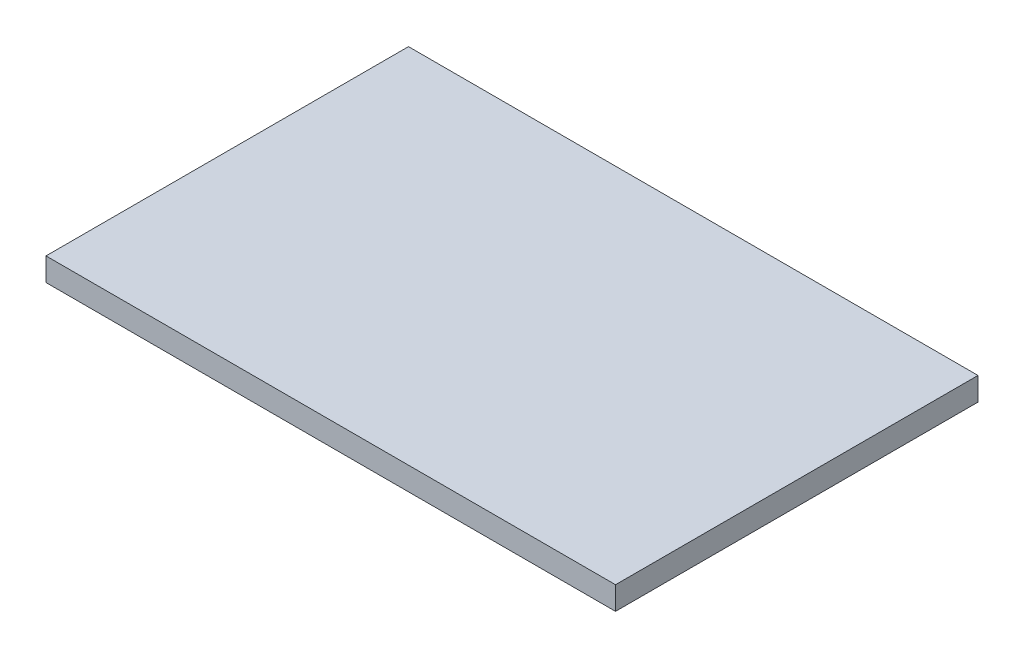
ISO-10303-21;
HEADER;
FILE_DESCRIPTION(('STEP AP214'),'2;1');
FILE_NAME('part.step','',(''),(''),'','','');
FILE_SCHEMA(('AUTOMOTIVE_DESIGN { 1 0 10303 214 1 1 1 1 }'));
ENDSEC;
DATA;
#1=APPLICATION_CONTEXT('core data for automotive mechanical design processes');
#2=APPLICATION_PROTOCOL_DEFINITION('international standard','automotive_design',2000,#1);
#3=PRODUCT_CONTEXT('',#1,'mechanical');
#4=PRODUCT('Part','Part','',(#3));
#5=PRODUCT_RELATED_PRODUCT_CATEGORY('part','',(#4));
#6=PRODUCT_DEFINITION_FORMATION('','',#4);
#7=PRODUCT_DEFINITION_CONTEXT('part definition',#1,'design');
#8=PRODUCT_DEFINITION('design','',#6,#7);
#9=PRODUCT_DEFINITION_SHAPE('','',#8);
#10=(LENGTH_UNIT() NAMED_UNIT(*) SI_UNIT(.MILLI.,.METRE.));
#11=(NAMED_UNIT(*) PLANE_ANGLE_UNIT() SI_UNIT($,.RADIAN.));
#12=(NAMED_UNIT(*) SI_UNIT($,.STERADIAN.) SOLID_ANGLE_UNIT());
#13=UNCERTAINTY_MEASURE_WITH_UNIT(LENGTH_MEASURE(1.E-05),#10,'distance_accuracy_value','');
#14=(GEOMETRIC_REPRESENTATION_CONTEXT(3) GLOBAL_UNCERTAINTY_ASSIGNED_CONTEXT((#13)) GLOBAL_UNIT_ASSIGNED_CONTEXT((#10,
#11,#12)) REPRESENTATION_CONTEXT('',''));
#15=CARTESIAN_POINT('',(0.,0.,0.));
#16=DIRECTION('',(0.,0.,1.));
#17=DIRECTION('',(1.,0.,0.));
#18=AXIS2_PLACEMENT_3D('',#15,#16,#17);
#19=CARTESIAN_POINT('',(0.,50.8,0.));
#20=DIRECTION('',(1.,0.,0.));
#21=DIRECTION('',(0.,0.,-1.));
#22=AXIS2_PLACEMENT_3D('',#19,#20,#21);
#23=PLANE('',#22);
#24=DIRECTION('',(0.,0.,1.));
#25=VECTOR('',#24,1.);
#26=CARTESIAN_POINT('',(0.,0.,0.));
#27=LINE('',#26,#25);
#28=CARTESIAN_POINT('',(0.,0.,0.));
#29=VERTEX_POINT('',#28);
#30=CARTESIAN_POINT('',(0.,0.,797.1));
#31=VERTEX_POINT('',#30);
#32=EDGE_CURVE('E98',#29,#31,#27,.T.);
#33=ORIENTED_EDGE('',*,*,#32,.T.);
#34=DIRECTION('',(0.,-1.,0.));
#35=VECTOR('',#34,1.);
#36=CARTESIAN_POINT('',(0.,50.8,797.1));
#37=LINE('',#36,#35);
#38=CARTESIAN_POINT('',(0.,50.8,797.1));
#39=VERTEX_POINT('',#38);
#40=EDGE_CURVE('E11',#39,#31,#37,.T.);
#41=ORIENTED_EDGE('',*,*,#40,.F.);
#42=DIRECTION('',(0.,0.,1.));
#43=VECTOR('',#42,1.);
#44=CARTESIAN_POINT('',(0.,50.8,0.));
#45=LINE('',#44,#43);
#46=CARTESIAN_POINT('',(0.,50.8,0.));
#47=VERTEX_POINT('',#46);
#48=EDGE_CURVE('E86',#47,#39,#45,.T.);
#49=ORIENTED_EDGE('',*,*,#48,.F.);
#50=DIRECTION('',(0.,-1.,0.));
#51=VECTOR('',#50,1.);
#52=CARTESIAN_POINT('',(0.,50.8,0.));
#53=LINE('',#52,#51);
#54=EDGE_CURVE('E94',#47,#29,#53,.T.);
#55=ORIENTED_EDGE('',*,*,#54,.T.);
#56=EDGE_LOOP('',(#33,#41,#49,#55));
#57=FACE_BOUND('',#56,.T.);
#58=ADVANCED_FACE('F35',(#57),#23,.F.);
#59=CARTESIAN_POINT('',(0.,50.8,797.1));
#60=DIRECTION('',(0.,0.,-1.));
#61=DIRECTION('',(-1.,0.,0.));
#62=AXIS2_PLACEMENT_3D('',#59,#60,#61);
#63=PLANE('',#62);
#64=DIRECTION('',(1.,0.,0.));
#65=VECTOR('',#64,1.);
#66=CARTESIAN_POINT('',(0.,0.,797.1));
#67=LINE('',#66,#65);
#68=CARTESIAN_POINT('',(1252.4,0.,797.1));
#69=VERTEX_POINT('',#68);
#70=EDGE_CURVE('E90',#31,#69,#67,.T.);
#71=ORIENTED_EDGE('',*,*,#70,.T.);
#72=DIRECTION('',(0.,-1.,0.));
#73=VECTOR('',#72,1.);
#74=CARTESIAN_POINT('',(1252.4,50.8,797.1));
#75=LINE('',#74,#73);
#76=CARTESIAN_POINT('',(1252.4,50.8,797.1));
#77=VERTEX_POINT('',#76);
#78=EDGE_CURVE('E43',#77,#69,#75,.T.);
#79=ORIENTED_EDGE('',*,*,#78,.F.);
#80=DIRECTION('',(1.,0.,0.));
#81=VECTOR('',#80,1.);
#82=CARTESIAN_POINT('',(0.,50.8,797.1));
#83=LINE('',#82,#81);
#84=EDGE_CURVE('E81',#39,#77,#83,.T.);
#85=ORIENTED_EDGE('',*,*,#84,.F.);
#86=ORIENTED_EDGE('',*,*,#40,.T.);
#87=EDGE_LOOP('',(#71,#79,#85,#86));
#88=FACE_BOUND('',#87,.T.);
#89=ADVANCED_FACE('F89',(#88),#63,.F.);
#90=CARTESIAN_POINT('',(1252.4,50.8,0.));
#91=DIRECTION('',(-1.,0.,0.));
#92=DIRECTION('',(0.,0.,1.));
#93=AXIS2_PLACEMENT_3D('',#90,#91,#92);
#94=PLANE('',#93);
#95=DIRECTION('',(0.,0.,-1.));
#96=VECTOR('',#95,1.);
#97=CARTESIAN_POINT('',(1252.4,0.,0.));
#98=LINE('',#97,#96);
#99=CARTESIAN_POINT('',(1252.4,0.,0.));
#100=VERTEX_POINT('',#99);
#101=EDGE_CURVE('E68',#69,#100,#98,.T.);
#102=ORIENTED_EDGE('',*,*,#101,.T.);
#103=DIRECTION('',(0.,-1.,0.));
#104=VECTOR('',#103,1.);
#105=CARTESIAN_POINT('',(1252.4,50.8,0.));
#106=LINE('',#105,#104);
#107=CARTESIAN_POINT('',(1252.4,50.8,0.));
#108=VERTEX_POINT('',#107);
#109=EDGE_CURVE('E91',#108,#100,#106,.T.);
#110=ORIENTED_EDGE('',*,*,#109,.F.);
#111=DIRECTION('',(0.,0.,-1.));
#112=VECTOR('',#111,1.);
#113=CARTESIAN_POINT('',(1252.4,50.8,0.));
#114=LINE('',#113,#112);
#115=EDGE_CURVE('E84',#77,#108,#114,.T.);
#116=ORIENTED_EDGE('',*,*,#115,.F.);
#117=ORIENTED_EDGE('',*,*,#78,.T.);
#118=EDGE_LOOP('',(#102,#110,#116,#117));
#119=FACE_BOUND('',#118,.T.);
#120=ADVANCED_FACE('F92',(#119),#94,.F.);
#121=CARTESIAN_POINT('',(0.,50.8,0.));
#122=DIRECTION('',(0.,0.,1.));
#123=DIRECTION('',(1.,0.,0.));
#124=AXIS2_PLACEMENT_3D('',#121,#122,#123);
#125=PLANE('',#124);
#126=DIRECTION('',(-1.,0.,0.));
#127=VECTOR('',#126,1.);
#128=CARTESIAN_POINT('',(0.,0.,0.));
#129=LINE('',#128,#127);
#130=EDGE_CURVE('E74',#100,#29,#129,.T.);
#131=ORIENTED_EDGE('',*,*,#130,.T.);
#132=ORIENTED_EDGE('',*,*,#54,.F.);
#133=DIRECTION('',(-1.,0.,0.));
#134=VECTOR('',#133,1.);
#135=CARTESIAN_POINT('',(0.,50.8,0.));
#136=LINE('',#135,#134);
#137=EDGE_CURVE('E51',#108,#47,#136,.T.);
#138=ORIENTED_EDGE('',*,*,#137,.F.);
#139=ORIENTED_EDGE('',*,*,#109,.T.);
#140=EDGE_LOOP('',(#131,#132,#138,#139));
#141=FACE_BOUND('',#140,.T.);
#142=ADVANCED_FACE('F105',(#141),#125,.F.);
#143=CARTESIAN_POINT('',(0.,50.8,0.));
#144=DIRECTION('',(0.,1.,0.));
#145=DIRECTION('',(0.,0.,1.));
#146=AXIS2_PLACEMENT_3D('',#143,#144,#145);
#147=PLANE('',#146);
#148=ORIENTED_EDGE('',*,*,#48,.T.);
#149=ORIENTED_EDGE('',*,*,#84,.T.);
#150=ORIENTED_EDGE('',*,*,#115,.T.);
#151=ORIENTED_EDGE('',*,*,#137,.T.);
#152=EDGE_LOOP('',(#148,#149,#150,#151));
#153=FACE_BOUND('',#152,.T.);
#154=ADVANCED_FACE('F82',(#153),#147,.T.);
#155=CARTESIAN_POINT('',(0.,0.,0.));
#156=DIRECTION('',(0.,1.,0.));
#157=DIRECTION('',(0.,0.,1.));
#158=AXIS2_PLACEMENT_3D('',#155,#156,#157);
#159=PLANE('',#158);
#160=ORIENTED_EDGE('',*,*,#32,.F.);
#161=ORIENTED_EDGE('',*,*,#130,.F.);
#162=ORIENTED_EDGE('',*,*,#101,.F.);
#163=ORIENTED_EDGE('',*,*,#70,.F.);
#164=EDGE_LOOP('',(#160,#161,#162,#163));
#165=FACE_BOUND('',#164,.T.);
#166=ADVANCED_FACE('F108',(#165),#159,.F.);
#167=CLOSED_SHELL('',(#58,#89,#120,#142,#154,#166));
#168=MANIFOLD_SOLID_BREP('B2',#167);
#169=ADVANCED_BREP_SHAPE_REPRESENTATION('',(#18,#168),#14);
#170=SHAPE_DEFINITION_REPRESENTATION(#9,#169);
ENDSEC;
END-ISO-10303-21;
